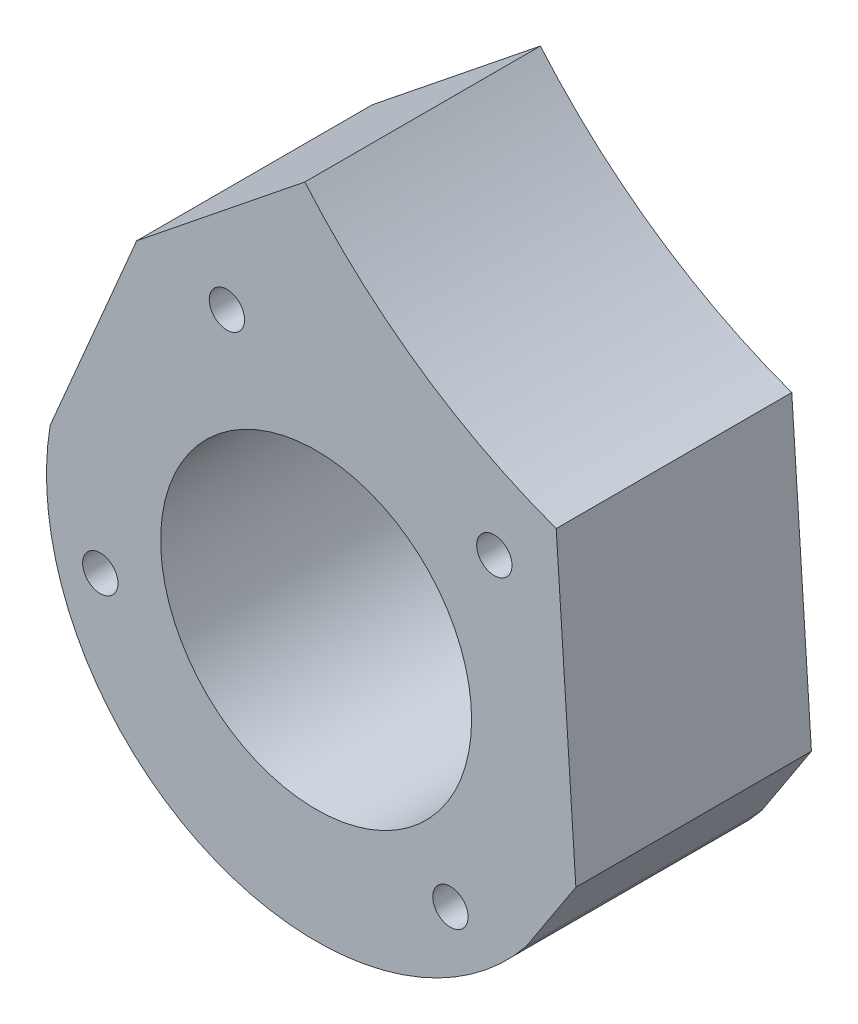
ISO-10303-21;
HEADER;
FILE_DESCRIPTION(('STEP AP214'),'2;1');
FILE_NAME('part.step','',(''),(''),'','','');
FILE_SCHEMA(('AUTOMOTIVE_DESIGN { 1 0 10303 214 1 1 1 1 }'));
ENDSEC;
DATA;
#1=APPLICATION_CONTEXT('core data for automotive mechanical design processes');
#2=APPLICATION_PROTOCOL_DEFINITION('international standard','automotive_design',2000,#1);
#3=PRODUCT_CONTEXT('',#1,'mechanical');
#4=PRODUCT('Part','Part','',(#3));
#5=PRODUCT_RELATED_PRODUCT_CATEGORY('part','',(#4));
#6=PRODUCT_DEFINITION_FORMATION('','',#4);
#7=PRODUCT_DEFINITION_CONTEXT('part definition',#1,'design');
#8=PRODUCT_DEFINITION('design','',#6,#7);
#9=PRODUCT_DEFINITION_SHAPE('','',#8);
#10=(LENGTH_UNIT() NAMED_UNIT(*) SI_UNIT(.MILLI.,.METRE.));
#11=(NAMED_UNIT(*) PLANE_ANGLE_UNIT() SI_UNIT($,.RADIAN.));
#12=(NAMED_UNIT(*) SI_UNIT($,.STERADIAN.) SOLID_ANGLE_UNIT());
#13=UNCERTAINTY_MEASURE_WITH_UNIT(LENGTH_MEASURE(1.E-05),#10,'distance_accuracy_value','');
#14=(GEOMETRIC_REPRESENTATION_CONTEXT(3) GLOBAL_UNCERTAINTY_ASSIGNED_CONTEXT((#13)) GLOBAL_UNIT_ASSIGNED_CONTEXT((#10,
#11,#12)) REPRESENTATION_CONTEXT('',''));
#15=CARTESIAN_POINT('',(0.,0.,0.));
#16=DIRECTION('',(0.,0.,1.));
#17=DIRECTION('',(1.,0.,0.));
#18=AXIS2_PLACEMENT_3D('',#15,#16,#17);
#19=CARTESIAN_POINT('',(-11.4009880011473,16.9982713890166,20.));
#20=DIRECTION('',(0.,0.,1.));
#21=DIRECTION('',(1.,0.,0.));
#22=AXIS2_PLACEMENT_3D('',#19,#20,#21);
#23=PLANE('',#22);
#24=CARTESIAN_POINT('',(-18.9758956741244,36.7568934569165,20.));
#25=DIRECTION('',(0.,0.,-1.));
#26=DIRECTION('',(-1.,0.,0.));
#27=AXIS2_PLACEMENT_3D('',#24,#25,#26);
#28=CIRCLE('',#27,1.5);
#29=CARTESIAN_POINT('',(-20.4758956741244,36.7568934569165,20.));
#30=VERTEX_POINT('',#29);
#31=EDGE_CURVE('E203',#30,#30,#28,.T.);
#32=ORIENTED_EDGE('',*,*,#31,.T.);
#33=EDGE_LOOP('',(#32));
#34=FACE_BOUND('',#33,.T.);
#35=CARTESIAN_POINT('',(-29.7234395896453,12.0051479368328,20.));
#36=DIRECTION('',(0.,0.,-1.));
#37=DIRECTION('',(-1.,0.,0.));
#38=AXIS2_PLACEMENT_3D('',#35,#36,#37);
#39=CIRCLE('',#38,1.5);
#40=CARTESIAN_POINT('',(-31.2234395896453,12.0051479368328,20.));
#41=VERTEX_POINT('',#40);
#42=EDGE_CURVE('E188',#41,#41,#39,.T.);
#43=ORIENTED_EDGE('',*,*,#42,.T.);
#44=EDGE_LOOP('',(#43));
#45=FACE_BOUND('',#44,.T.);
#46=CARTESIAN_POINT('',(0.,2.33927911438414,20.));
#47=DIRECTION('',(0.,0.,-1.));
#48=DIRECTION('',(-1.,0.,0.));
#49=AXIS2_PLACEMENT_3D('',#46,#47,#48);
#50=CIRCLE('',#49,1.5);
#51=CARTESIAN_POINT('',(-1.5,2.33927911438414,20.));
#52=VERTEX_POINT('',#51);
#53=EDGE_CURVE('E193',#52,#52,#50,.T.);
#54=ORIENTED_EDGE('',*,*,#53,.T.);
#55=EDGE_LOOP('',(#54));
#56=FACE_BOUND('',#55,.T.);
#57=CARTESIAN_POINT('',(3.72987243319756,30.0545481940957,20.));
#58=DIRECTION('',(0.,0.,-1.));
#59=DIRECTION('',(-1.,0.,0.));
#60=AXIS2_PLACEMENT_3D('',#57,#58,#59);
#61=CIRCLE('',#60,1.5);
#62=CARTESIAN_POINT('',(2.22987243319756,30.0545481940957,20.));
#63=VERTEX_POINT('',#62);
#64=EDGE_CURVE('E208',#63,#63,#61,.T.);
#65=ORIENTED_EDGE('',*,*,#64,.T.);
#66=EDGE_LOOP('',(#65));
#67=FACE_BOUND('',#66,.T.);
#68=CARTESIAN_POINT('',(-11.4009880011473,16.9982713890166,20.));
#69=DIRECTION('',(0.,0.,1.));
#70=DIRECTION('',(1.,0.,0.));
#71=AXIS2_PLACEMENT_3D('',#68,#69,#70);
#72=CIRCLE('',#71,22.8913557565424);
#73=CARTESIAN_POINT('',(-33.982028450611,20.7547032854134,20.));
#74=VERTEX_POINT('',#73);
#75=CARTESIAN_POINT('',(6.44479261261674,2.66152550098499,20.));
#76=VERTEX_POINT('',#75);
#77=EDGE_CURVE('E131',#74,#76,#72,.T.);
#78=ORIENTED_EDGE('',*,*,#77,.T.);
#79=DIRECTION('',(0.546826185761516,0.837246154106134,0.));
#80=VECTOR('',#79,1.);
#81=CARTESIAN_POINT('',(10.6520193002753,9.1032147532825,20.));
#82=LINE('',#81,#80);
#83=CARTESIAN_POINT('',(10.6520193002753,9.1032147532825,20.));
#84=VERTEX_POINT('',#83);
#85=EDGE_CURVE('E88',#76,#84,#82,.T.);
#86=ORIENTED_EDGE('',*,*,#85,.T.);
#87=DIRECTION('',(-0.0652435193438303,0.99786937180356,0.));
#88=VECTOR('',#87,1.);
#89=CARTESIAN_POINT('',(10.6520193002753,9.1032147532825,20.));
#90=LINE('',#89,#88);
#91=CARTESIAN_POINT('',(8.98207019995687,34.6443118068736,20.));
#92=VERTEX_POINT('',#91);
#93=EDGE_CURVE('E101',#84,#92,#90,.T.);
#94=ORIENTED_EDGE('',*,*,#93,.T.);
#95=CARTESIAN_POINT('',(26.4246299559225,82.5688056399812,20.));
#96=DIRECTION('',(0.,0.,-1.));
#97=DIRECTION('',(1.,0.,0.));
#98=AXIS2_PLACEMENT_3D('',#95,#96,#97);
#99=CIRCLE('',#98,51.);
#100=CARTESIAN_POINT('',(-12.3604282838308,49.4520537258978,20.));
#101=VERTEX_POINT('',#100);
#102=EDGE_CURVE('E95',#92,#101,#99,.T.);
#103=ORIENTED_EDGE('',*,*,#102,.T.);
#104=DIRECTION('',(-0.779814258514439,-0.626010960141734,0.));
#105=VECTOR('',#104,1.);
#106=CARTESIAN_POINT('',(-12.8825099746233,49.0329425632627,20.));
#107=LINE('',#106,#105);
#108=CARTESIAN_POINT('',(-26.6366593754456,37.9915334349604,20.));
#109=VERTEX_POINT('',#108);
#110=EDGE_CURVE('E99',#101,#109,#107,.T.);
#111=ORIENTED_EDGE('',*,*,#110,.T.);
#112=DIRECTION('',(-0.392031749345172,-0.919951687593085,0.));
#113=VECTOR('',#112,1.);
#114=CARTESIAN_POINT('',(-26.6366593754456,37.9915334349604,20.));
#115=LINE('',#114,#113);
#116=EDGE_CURVE('E52',#109,#74,#115,.T.);
#117=ORIENTED_EDGE('',*,*,#116,.T.);
#118=EDGE_LOOP('',(#78,#86,#94,#103,#111,#117));
#119=FACE_BOUND('',#118,.T.);
#120=CARTESIAN_POINT('',(-11.4009880011655,16.998271389033,20.));
#121=DIRECTION('',(0.,0.,1.));
#122=DIRECTION('',(1.,0.,0.));
#123=AXIS2_PLACEMENT_3D('',#120,#121,#122);
#124=CIRCLE('',#123,13.2);
#125=CARTESIAN_POINT('',(1.79901199883452,16.998271389033,20.));
#126=VERTEX_POINT('',#125);
#127=EDGE_CURVE('E124',#126,#126,#124,.T.);
#128=ORIENTED_EDGE('',*,*,#127,.F.);
#129=EDGE_LOOP('',(#128));
#130=FACE_BOUND('',#129,.T.);
#131=ADVANCED_FACE('F35',(#34,#45,#56,#67,#119,#130),#23,.T.);
#132=CARTESIAN_POINT('',(-11.4009880011473,16.9982713890166,0.));
#133=DIRECTION('',(0.,0.,1.));
#134=DIRECTION('',(1.,0.,0.));
#135=AXIS2_PLACEMENT_3D('',#132,#133,#134);
#136=PLANE('',#135);
#137=CARTESIAN_POINT('',(-18.9758956741244,36.7568934569165,0.));
#138=DIRECTION('',(0.,0.,-1.));
#139=DIRECTION('',(-1.,0.,0.));
#140=AXIS2_PLACEMENT_3D('',#137,#138,#139);
#141=CIRCLE('',#140,1.5);
#142=CARTESIAN_POINT('',(-20.4758956741244,36.7568934569165,0.));
#143=VERTEX_POINT('',#142);
#144=EDGE_CURVE('E195',#143,#143,#141,.T.);
#145=ORIENTED_EDGE('',*,*,#144,.F.);
#146=EDGE_LOOP('',(#145));
#147=FACE_BOUND('',#146,.T.);
#148=CARTESIAN_POINT('',(-29.7234395896453,12.0051479368328,0.));
#149=DIRECTION('',(0.,0.,-1.));
#150=DIRECTION('',(-1.,0.,0.));
#151=AXIS2_PLACEMENT_3D('',#148,#149,#150);
#152=CIRCLE('',#151,1.5);
#153=CARTESIAN_POINT('',(-31.2234395896453,12.0051479368328,0.));
#154=VERTEX_POINT('',#153);
#155=EDGE_CURVE('E191',#154,#154,#152,.T.);
#156=ORIENTED_EDGE('',*,*,#155,.F.);
#157=EDGE_LOOP('',(#156));
#158=FACE_BOUND('',#157,.T.);
#159=CARTESIAN_POINT('',(0.,2.33927911438414,0.));
#160=DIRECTION('',(0.,0.,-1.));
#161=DIRECTION('',(-1.,0.,0.));
#162=AXIS2_PLACEMENT_3D('',#159,#160,#161);
#163=CIRCLE('',#162,1.5);
#164=CARTESIAN_POINT('',(-1.5,2.33927911438414,0.));
#165=VERTEX_POINT('',#164);
#166=EDGE_CURVE('E198',#165,#165,#163,.T.);
#167=ORIENTED_EDGE('',*,*,#166,.F.);
#168=EDGE_LOOP('',(#167));
#169=FACE_BOUND('',#168,.T.);
#170=CARTESIAN_POINT('',(3.72987243319756,30.0545481940957,0.));
#171=DIRECTION('',(0.,0.,-1.));
#172=DIRECTION('',(-1.,0.,0.));
#173=AXIS2_PLACEMENT_3D('',#170,#171,#172);
#174=CIRCLE('',#173,1.5);
#175=CARTESIAN_POINT('',(2.22987243319756,30.0545481940957,0.));
#176=VERTEX_POINT('',#175);
#177=EDGE_CURVE('E205',#176,#176,#174,.T.);
#178=ORIENTED_EDGE('',*,*,#177,.F.);
#179=EDGE_LOOP('',(#178));
#180=FACE_BOUND('',#179,.T.);
#181=CARTESIAN_POINT('',(-11.4009880011473,16.9982713890166,0.));
#182=DIRECTION('',(0.,0.,1.));
#183=DIRECTION('',(1.,0.,0.));
#184=AXIS2_PLACEMENT_3D('',#181,#182,#183);
#185=CIRCLE('',#184,22.8913557565424);
#186=CARTESIAN_POINT('',(-33.982028450611,20.7547032854134,0.));
#187=VERTEX_POINT('',#186);
#188=CARTESIAN_POINT('',(6.44479261261674,2.66152550098499,0.));
#189=VERTEX_POINT('',#188);
#190=EDGE_CURVE('E120',#187,#189,#185,.T.);
#191=ORIENTED_EDGE('',*,*,#190,.F.);
#192=DIRECTION('',(-0.392031749345172,-0.919951687593085,0.));
#193=VECTOR('',#192,1.);
#194=CARTESIAN_POINT('',(-26.6366593754456,37.9915334349604,0.));
#195=LINE('',#194,#193);
#196=CARTESIAN_POINT('',(-26.6366593754456,37.9915334349604,0.));
#197=VERTEX_POINT('',#196);
#198=EDGE_CURVE('E80',#197,#187,#195,.T.);
#199=ORIENTED_EDGE('',*,*,#198,.F.);
#200=DIRECTION('',(-0.779814258514438,-0.626010960141735,0.));
#201=VECTOR('',#200,1.);
#202=CARTESIAN_POINT('',(-26.6366593754456,37.9915334349604,0.));
#203=LINE('',#202,#201);
#204=CARTESIAN_POINT('',(-12.3604282838308,49.4520537258978,0.));
#205=VERTEX_POINT('',#204);
#206=EDGE_CURVE('E74',#205,#197,#203,.T.);
#207=ORIENTED_EDGE('',*,*,#206,.F.);
#208=CARTESIAN_POINT('',(26.4246299559225,82.5688056399812,0.));
#209=DIRECTION('',(0.,0.,-1.));
#210=DIRECTION('',(1.,0.,0.));
#211=AXIS2_PLACEMENT_3D('',#208,#209,#210);
#212=CIRCLE('',#211,51.);
#213=CARTESIAN_POINT('',(8.98207019995687,34.6443118068736,0.));
#214=VERTEX_POINT('',#213);
#215=EDGE_CURVE('E110',#214,#205,#212,.T.);
#216=ORIENTED_EDGE('',*,*,#215,.F.);
#217=DIRECTION('',(-0.0652435193438303,0.99786937180356,0.));
#218=VECTOR('',#217,1.);
#219=CARTESIAN_POINT('',(10.6520193002753,9.1032147532825,0.));
#220=LINE('',#219,#218);
#221=CARTESIAN_POINT('',(10.6520193002753,9.1032147532825,0.));
#222=VERTEX_POINT('',#221);
#223=EDGE_CURVE('E126',#222,#214,#220,.T.);
#224=ORIENTED_EDGE('',*,*,#223,.F.);
#225=DIRECTION('',(0.546826185761516,0.837246154106134,0.));
#226=VECTOR('',#225,1.);
#227=CARTESIAN_POINT('',(10.6520193002753,9.1032147532825,0.));
#228=LINE('',#227,#226);
#229=EDGE_CURVE('E123',#189,#222,#228,.T.);
#230=ORIENTED_EDGE('',*,*,#229,.F.);
#231=EDGE_LOOP('',(#191,#199,#207,#216,#224,#230));
#232=FACE_BOUND('',#231,.T.);
#233=CARTESIAN_POINT('',(-11.4009880011655,16.998271389033,0.));
#234=DIRECTION('',(0.,0.,1.));
#235=DIRECTION('',(1.,0.,0.));
#236=AXIS2_PLACEMENT_3D('',#233,#234,#235);
#237=CIRCLE('',#236,13.2);
#238=CARTESIAN_POINT('',(1.79901199883452,16.998271389033,0.));
#239=VERTEX_POINT('',#238);
#240=EDGE_CURVE('E211',#239,#239,#237,.T.);
#241=ORIENTED_EDGE('',*,*,#240,.T.);
#242=EDGE_LOOP('',(#241));
#243=FACE_BOUND('',#242,.T.);
#244=ADVANCED_FACE('F140',(#147,#158,#169,#180,#232,#243),#136,.F.);
#245=CARTESIAN_POINT('',(-11.4009880011473,16.9982713890166,20.));
#246=DIRECTION('',(0.,0.,-1.));
#247=DIRECTION('',(-1.,0.,0.));
#248=AXIS2_PLACEMENT_3D('',#245,#246,#247);
#249=CYLINDRICAL_SURFACE('',#248,22.8913557565424);
#250=ORIENTED_EDGE('',*,*,#190,.T.);
#251=DIRECTION('',(0.,0.,-1.));
#252=VECTOR('',#251,1.);
#253=CARTESIAN_POINT('',(6.44479261261674,2.66152550098499,20.));
#254=LINE('',#253,#252);
#255=EDGE_CURVE('E11',#76,#189,#254,.T.);
#256=ORIENTED_EDGE('',*,*,#255,.F.);
#257=ORIENTED_EDGE('',*,*,#77,.F.);
#258=DIRECTION('',(0.,0.,-1.));
#259=VECTOR('',#258,1.);
#260=CARTESIAN_POINT('',(-33.982028450611,20.7547032854134,20.));
#261=LINE('',#260,#259);
#262=EDGE_CURVE('E116',#74,#187,#261,.T.);
#263=ORIENTED_EDGE('',*,*,#262,.T.);
#264=EDGE_LOOP('',(#250,#256,#257,#263));
#265=FACE_BOUND('',#264,.T.);
#266=ADVANCED_FACE('F37',(#265),#249,.T.);
#267=CARTESIAN_POINT('',(10.6520193002753,9.1032147532825,20.));
#268=DIRECTION('',(-0.837246154106134,0.546826185761516,0.));
#269=DIRECTION('',(-0.546826185761516,-0.837246154106134,0.));
#270=AXIS2_PLACEMENT_3D('',#267,#268,#269);
#271=PLANE('',#270);
#272=ORIENTED_EDGE('',*,*,#229,.T.);
#273=DIRECTION('',(0.,0.,-1.));
#274=VECTOR('',#273,1.);
#275=CARTESIAN_POINT('',(10.6520193002753,9.1032147532825,20.));
#276=LINE('',#275,#274);
#277=EDGE_CURVE('E44',#84,#222,#276,.T.);
#278=ORIENTED_EDGE('',*,*,#277,.F.);
#279=ORIENTED_EDGE('',*,*,#85,.F.);
#280=ORIENTED_EDGE('',*,*,#255,.T.);
#281=EDGE_LOOP('',(#272,#278,#279,#280));
#282=FACE_BOUND('',#281,.T.);
#283=ADVANCED_FACE('F286',(#282),#271,.F.);
#284=CARTESIAN_POINT('',(10.6520193002753,9.1032147532825,20.));
#285=DIRECTION('',(-0.99786937180356,-0.0652435193438303,0.));
#286=DIRECTION('',(0.0652435193438303,-0.99786937180356,0.));
#287=AXIS2_PLACEMENT_3D('',#284,#285,#286);
#288=PLANE('',#287);
#289=ORIENTED_EDGE('',*,*,#223,.T.);
#290=DIRECTION('',(0.,0.,-1.));
#291=VECTOR('',#290,1.);
#292=CARTESIAN_POINT('',(8.98207019995687,34.6443118068736,20.));
#293=LINE('',#292,#291);
#294=EDGE_CURVE('E111',#92,#214,#293,.T.);
#295=ORIENTED_EDGE('',*,*,#294,.F.);
#296=ORIENTED_EDGE('',*,*,#93,.F.);
#297=ORIENTED_EDGE('',*,*,#277,.T.);
#298=EDGE_LOOP('',(#289,#295,#296,#297));
#299=FACE_BOUND('',#298,.T.);
#300=ADVANCED_FACE('F137',(#299),#288,.F.);
#301=CARTESIAN_POINT('',(26.4246299559225,82.5688056399812,20.));
#302=DIRECTION('',(0.,0.,-1.));
#303=DIRECTION('',(-1.,0.,0.));
#304=AXIS2_PLACEMENT_3D('',#301,#302,#303);
#305=CYLINDRICAL_SURFACE('',#304,51.);
#306=ORIENTED_EDGE('',*,*,#215,.T.);
#307=DIRECTION('',(0.,0.,-1.));
#308=VECTOR('',#307,1.);
#309=CARTESIAN_POINT('',(-12.3604282838308,49.4520537258978,20.));
#310=LINE('',#309,#308);
#311=EDGE_CURVE('E107',#101,#205,#310,.T.);
#312=ORIENTED_EDGE('',*,*,#311,.F.);
#313=ORIENTED_EDGE('',*,*,#102,.F.);
#314=ORIENTED_EDGE('',*,*,#294,.T.);
#315=EDGE_LOOP('',(#306,#312,#313,#314));
#316=FACE_BOUND('',#315,.T.);
#317=ADVANCED_FACE('F108',(#316),#305,.F.);
#318=CARTESIAN_POINT('',(-26.6366593754456,37.9915334349604,20.));
#319=DIRECTION('',(0.626010960141735,-0.779814258514438,0.));
#320=DIRECTION('',(0.779814258514438,0.626010960141735,0.));
#321=AXIS2_PLACEMENT_3D('',#318,#319,#320);
#322=PLANE('',#321);
#323=ORIENTED_EDGE('',*,*,#206,.T.);
#324=DIRECTION('',(0.,0.,-1.));
#325=VECTOR('',#324,1.);
#326=CARTESIAN_POINT('',(-26.6366593754456,37.9915334349604,20.));
#327=LINE('',#326,#325);
#328=EDGE_CURVE('E112',#109,#197,#327,.T.);
#329=ORIENTED_EDGE('',*,*,#328,.F.);
#330=ORIENTED_EDGE('',*,*,#110,.F.);
#331=ORIENTED_EDGE('',*,*,#311,.T.);
#332=EDGE_LOOP('',(#323,#329,#330,#331));
#333=FACE_BOUND('',#332,.T.);
#334=ADVANCED_FACE('F114',(#333),#322,.F.);
#335=CARTESIAN_POINT('',(-26.6366593754456,37.9915334349604,20.));
#336=DIRECTION('',(0.919951687593085,-0.392031749345172,0.));
#337=DIRECTION('',(0.392031749345172,0.919951687593085,0.));
#338=AXIS2_PLACEMENT_3D('',#335,#336,#337);
#339=PLANE('',#338);
#340=ORIENTED_EDGE('',*,*,#198,.T.);
#341=ORIENTED_EDGE('',*,*,#262,.F.);
#342=ORIENTED_EDGE('',*,*,#116,.F.);
#343=ORIENTED_EDGE('',*,*,#328,.T.);
#344=EDGE_LOOP('',(#340,#341,#342,#343));
#345=FACE_BOUND('',#344,.T.);
#346=ADVANCED_FACE('F145',(#345),#339,.F.);
#347=CARTESIAN_POINT('',(-11.4009880011655,16.998271389033,20.));
#348=DIRECTION('',(0.,0.,-1.));
#349=DIRECTION('',(-1.,0.,0.));
#350=AXIS2_PLACEMENT_3D('',#347,#348,#349);
#351=CYLINDRICAL_SURFACE('',#350,13.2);
#352=ORIENTED_EDGE('',*,*,#127,.T.);
#353=EDGE_LOOP('',(#352));
#354=FACE_BOUND('',#353,.T.);
#355=ORIENTED_EDGE('',*,*,#240,.F.);
#356=EDGE_LOOP('',(#355));
#357=FACE_BOUND('',#356,.T.);
#358=ADVANCED_FACE('F147',(#354,#357),#351,.F.);
#359=CARTESIAN_POINT('',(3.72987243319756,30.0545481940957,20.));
#360=DIRECTION('',(0.,0.,-1.));
#361=DIRECTION('',(-1.,0.,0.));
#362=AXIS2_PLACEMENT_3D('',#359,#360,#361);
#363=CYLINDRICAL_SURFACE('',#362,1.5);
#364=ORIENTED_EDGE('',*,*,#64,.F.);
#365=EDGE_LOOP('',(#364));
#366=FACE_BOUND('',#365,.T.);
#367=ORIENTED_EDGE('',*,*,#177,.T.);
#368=EDGE_LOOP('',(#367));
#369=FACE_BOUND('',#368,.T.);
#370=ADVANCED_FACE('F153',(#366,#369),#363,.F.);
#371=CARTESIAN_POINT('',(0.,2.33927911438414,20.));
#372=DIRECTION('',(0.,0.,-1.));
#373=DIRECTION('',(-1.,0.,0.));
#374=AXIS2_PLACEMENT_3D('',#371,#372,#373);
#375=CYLINDRICAL_SURFACE('',#374,1.5);
#376=ORIENTED_EDGE('',*,*,#53,.F.);
#377=EDGE_LOOP('',(#376));
#378=FACE_BOUND('',#377,.T.);
#379=ORIENTED_EDGE('',*,*,#166,.T.);
#380=EDGE_LOOP('',(#379));
#381=FACE_BOUND('',#380,.T.);
#382=ADVANCED_FACE('F171',(#378,#381),#375,.F.);
#383=CARTESIAN_POINT('',(-29.7234395896453,12.0051479368328,20.));
#384=DIRECTION('',(0.,0.,-1.));
#385=DIRECTION('',(-1.,0.,0.));
#386=AXIS2_PLACEMENT_3D('',#383,#384,#385);
#387=CYLINDRICAL_SURFACE('',#386,1.5);
#388=ORIENTED_EDGE('',*,*,#42,.F.);
#389=EDGE_LOOP('',(#388));
#390=FACE_BOUND('',#389,.T.);
#391=ORIENTED_EDGE('',*,*,#155,.T.);
#392=EDGE_LOOP('',(#391));
#393=FACE_BOUND('',#392,.T.);
#394=ADVANCED_FACE('F176',(#390,#393),#387,.F.);
#395=CARTESIAN_POINT('',(-18.9758956741244,36.7568934569165,20.));
#396=DIRECTION('',(0.,0.,-1.));
#397=DIRECTION('',(-1.,0.,0.));
#398=AXIS2_PLACEMENT_3D('',#395,#396,#397);
#399=CYLINDRICAL_SURFACE('',#398,1.5);
#400=ORIENTED_EDGE('',*,*,#31,.F.);
#401=EDGE_LOOP('',(#400));
#402=FACE_BOUND('',#401,.T.);
#403=ORIENTED_EDGE('',*,*,#144,.T.);
#404=EDGE_LOOP('',(#403));
#405=FACE_BOUND('',#404,.T.);
#406=ADVANCED_FACE('F173',(#402,#405),#399,.F.);
#407=CLOSED_SHELL('',(#131,#244,#266,#283,#300,#317,#334,#346,#358,#370,#382,#394,#406));
#408=MANIFOLD_SOLID_BREP('B2',#407);
#409=ADVANCED_BREP_SHAPE_REPRESENTATION('',(#18,#408),#14);
#410=SHAPE_DEFINITION_REPRESENTATION(#9,#409);
ENDSEC;
END-ISO-10303-21;
